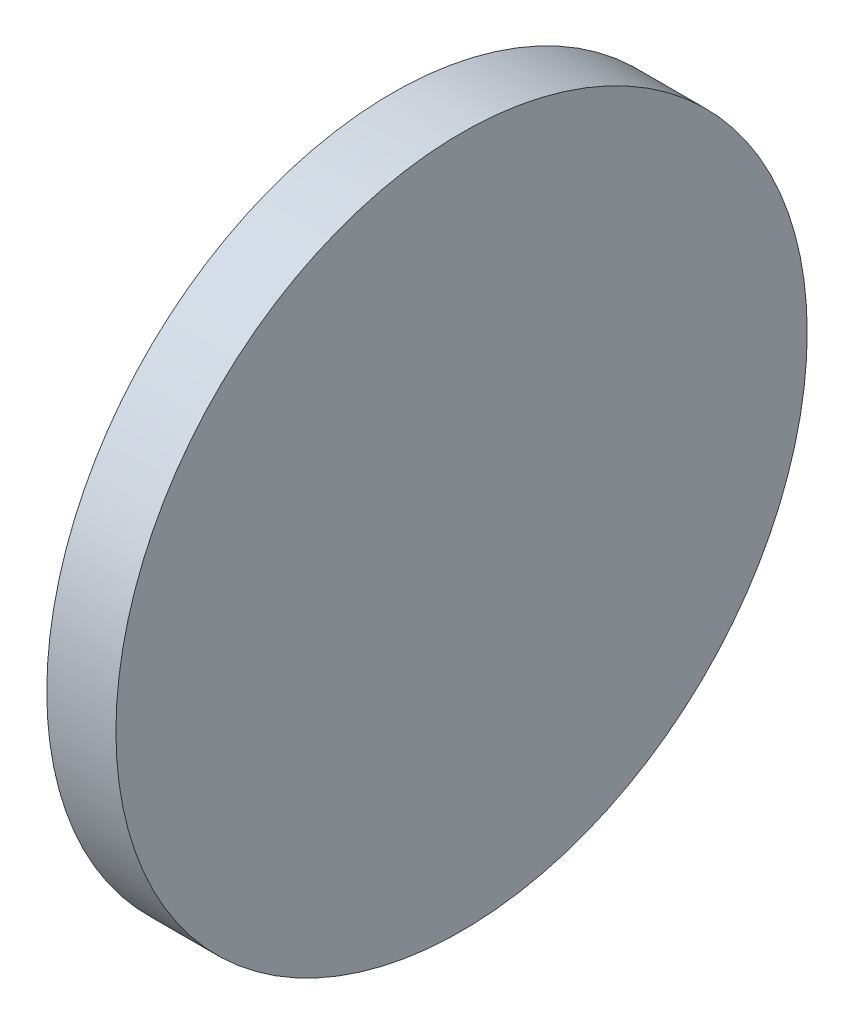
ISO-10303-21;
HEADER;
FILE_DESCRIPTION(('STEP AP214'),'2;1');
FILE_NAME('part.step','',(''),(''),'','','');
FILE_SCHEMA(('AUTOMOTIVE_DESIGN { 1 0 10303 214 1 1 1 1 }'));
ENDSEC;
DATA;
#1=APPLICATION_CONTEXT('core data for automotive mechanical design processes');
#2=APPLICATION_PROTOCOL_DEFINITION('international standard','automotive_design',2000,#1);
#3=PRODUCT_CONTEXT('',#1,'mechanical');
#4=PRODUCT('Part','Part','',(#3));
#5=PRODUCT_RELATED_PRODUCT_CATEGORY('part','',(#4));
#6=PRODUCT_DEFINITION_FORMATION('','',#4);
#7=PRODUCT_DEFINITION_CONTEXT('part definition',#1,'design');
#8=PRODUCT_DEFINITION('design','',#6,#7);
#9=PRODUCT_DEFINITION_SHAPE('','',#8);
#10=(LENGTH_UNIT() NAMED_UNIT(*) SI_UNIT(.MILLI.,.METRE.));
#11=(NAMED_UNIT(*) PLANE_ANGLE_UNIT() SI_UNIT($,.RADIAN.));
#12=(NAMED_UNIT(*) SI_UNIT($,.STERADIAN.) SOLID_ANGLE_UNIT());
#13=UNCERTAINTY_MEASURE_WITH_UNIT(LENGTH_MEASURE(1.E-05),#10,'distance_accuracy_value','');
#14=(GEOMETRIC_REPRESENTATION_CONTEXT(3) GLOBAL_UNCERTAINTY_ASSIGNED_CONTEXT((#13)) GLOBAL_UNIT_ASSIGNED_CONTEXT((#10,
#11,#12)) REPRESENTATION_CONTEXT('',''));
#15=CARTESIAN_POINT('',(0.,0.,0.));
#16=DIRECTION('',(0.,0.,1.));
#17=DIRECTION('',(1.,0.,0.));
#18=AXIS2_PLACEMENT_3D('',#15,#16,#17);
#19=CARTESIAN_POINT('',(0.,0.,0.));
#20=DIRECTION('',(1.,0.,0.));
#21=DIRECTION('',(0.,0.,-1.));
#22=AXIS2_PLACEMENT_3D('',#19,#20,#21);
#23=PLANE('',#22);
#24=CARTESIAN_POINT('',(0.,0.,-65.));
#25=DIRECTION('',(1.,0.,0.));
#26=DIRECTION('',(0.,0.,-1.));
#27=AXIS2_PLACEMENT_3D('',#24,#25,#26);
#28=CIRCLE('',#27,5.);
#29=CARTESIAN_POINT('',(0.,0.,-70.));
#30=VERTEX_POINT('',#29);
#31=EDGE_CURVE('E47',#30,#30,#28,.F.);
#32=ORIENTED_EDGE('',*,*,#31,.F.);
#33=EDGE_LOOP('',(#32));
#34=FACE_BOUND('',#33,.T.);
#35=CARTESIAN_POINT('',(0.,-65.,0.));
#36=DIRECTION('',(1.,0.,0.));
#37=DIRECTION('',(0.,0.,-1.));
#38=AXIS2_PLACEMENT_3D('',#35,#36,#37);
#39=CIRCLE('',#38,5.);
#40=CARTESIAN_POINT('',(0.,-65.,-5.));
#41=VERTEX_POINT('',#40);
#42=EDGE_CURVE('E57',#41,#41,#39,.F.);
#43=ORIENTED_EDGE('',*,*,#42,.F.);
#44=EDGE_LOOP('',(#43));
#45=FACE_BOUND('',#44,.T.);
#46=CARTESIAN_POINT('',(0.,0.,65.));
#47=DIRECTION('',(1.,0.,0.));
#48=DIRECTION('',(0.,0.,-1.));
#49=AXIS2_PLACEMENT_3D('',#46,#47,#48);
#50=CIRCLE('',#49,5.);
#51=CARTESIAN_POINT('',(0.,0.,60.));
#52=VERTEX_POINT('',#51);
#53=EDGE_CURVE('E67',#52,#52,#50,.F.);
#54=ORIENTED_EDGE('',*,*,#53,.F.);
#55=EDGE_LOOP('',(#54));
#56=FACE_BOUND('',#55,.T.);
#57=CARTESIAN_POINT('',(0.,65.,0.));
#58=DIRECTION('',(1.,0.,0.));
#59=DIRECTION('',(0.,0.,-1.));
#60=AXIS2_PLACEMENT_3D('',#57,#58,#59);
#61=CIRCLE('',#60,5.);
#62=CARTESIAN_POINT('',(0.,65.,-5.));
#63=VERTEX_POINT('',#62);
#64=EDGE_CURVE('E75',#63,#63,#61,.F.);
#65=ORIENTED_EDGE('',*,*,#64,.F.);
#66=EDGE_LOOP('',(#65));
#67=FACE_BOUND('',#66,.T.);
#68=CARTESIAN_POINT('',(0.,0.,0.));
#69=DIRECTION('',(1.,0.,0.));
#70=DIRECTION('',(0.,0.,-1.));
#71=AXIS2_PLACEMENT_3D('',#68,#69,#70);
#72=CIRCLE('',#71,100.);
#73=CARTESIAN_POINT('',(0.,0.,-100.));
#74=VERTEX_POINT('',#73);
#75=EDGE_CURVE('E80',#74,#74,#72,.T.);
#76=ORIENTED_EDGE('',*,*,#75,.F.);
#77=EDGE_LOOP('',(#76));
#78=FACE_BOUND('',#77,.T.);
#79=CARTESIAN_POINT('',(0.,45.9619407771253,45.9619407771258));
#80=DIRECTION('',(1.,0.,0.));
#81=DIRECTION('',(0.,0.,-1.));
#82=AXIS2_PLACEMENT_3D('',#79,#80,#81);
#83=CIRCLE('',#82,5.);
#84=CARTESIAN_POINT('',(0.,45.9619407771253,40.9619407771258));
#85=VERTEX_POINT('',#84);
#86=EDGE_CURVE('E71',#85,#85,#83,.F.);
#87=ORIENTED_EDGE('',*,*,#86,.F.);
#88=EDGE_LOOP('',(#87));
#89=FACE_BOUND('',#88,.T.);
#90=CARTESIAN_POINT('',(0.,-45.9619407771258,45.9619407771254));
#91=DIRECTION('',(1.,0.,0.));
#92=DIRECTION('',(0.,0.,-1.));
#93=AXIS2_PLACEMENT_3D('',#90,#91,#92);
#94=CIRCLE('',#93,5.);
#95=CARTESIAN_POINT('',(0.,-45.9619407771258,40.9619407771254));
#96=VERTEX_POINT('',#95);
#97=EDGE_CURVE('E63',#96,#96,#94,.F.);
#98=ORIENTED_EDGE('',*,*,#97,.F.);
#99=EDGE_LOOP('',(#98));
#100=FACE_BOUND('',#99,.T.);
#101=CARTESIAN_POINT('',(0.,-45.9619407771253,-45.9619407771258));
#102=DIRECTION('',(1.,0.,0.));
#103=DIRECTION('',(0.,0.,-1.));
#104=AXIS2_PLACEMENT_3D('',#101,#102,#103);
#105=CIRCLE('',#104,5.);
#106=CARTESIAN_POINT('',(0.,-45.9619407771253,-50.9619407771258));
#107=VERTEX_POINT('',#106);
#108=EDGE_CURVE('E52',#107,#107,#105,.F.);
#109=ORIENTED_EDGE('',*,*,#108,.F.);
#110=EDGE_LOOP('',(#109));
#111=FACE_BOUND('',#110,.T.);
#112=CARTESIAN_POINT('',(0.,45.9619407771258,-45.9619407771254));
#113=DIRECTION('',(1.,0.,0.));
#114=DIRECTION('',(0.,0.,-1.));
#115=AXIS2_PLACEMENT_3D('',#112,#113,#114);
#116=CIRCLE('',#115,5.);
#117=CARTESIAN_POINT('',(0.,45.9619407771258,-50.9619407771254));
#118=VERTEX_POINT('',#117);
#119=EDGE_CURVE('E11',#118,#118,#116,.F.);
#120=ORIENTED_EDGE('',*,*,#119,.F.);
#121=EDGE_LOOP('',(#120));
#122=FACE_BOUND('',#121,.T.);
#123=ADVANCED_FACE('F39',(#34,#45,#56,#67,#78,#89,#100,#111,#122),#23,.F.);
#124=CARTESIAN_POINT('',(20.,0.,0.));
#125=DIRECTION('',(-1.,0.,0.));
#126=DIRECTION('',(0.,0.,1.));
#127=AXIS2_PLACEMENT_3D('',#124,#125,#126);
#128=CYLINDRICAL_SURFACE('',#127,100.);
#129=CARTESIAN_POINT('',(20.,0.,0.));
#130=DIRECTION('',(1.,0.,0.));
#131=DIRECTION('',(0.,0.,-1.));
#132=AXIS2_PLACEMENT_3D('',#129,#130,#131);
#133=CIRCLE('',#132,100.);
#134=CARTESIAN_POINT('',(20.,0.,-100.));
#135=VERTEX_POINT('',#134);
#136=EDGE_CURVE('E79',#135,#135,#133,.T.);
#137=ORIENTED_EDGE('',*,*,#136,.F.);
#138=EDGE_LOOP('',(#137));
#139=FACE_BOUND('',#138,.T.);
#140=ORIENTED_EDGE('',*,*,#75,.T.);
#141=EDGE_LOOP('',(#140));
#142=FACE_BOUND('',#141,.T.);
#143=ADVANCED_FACE('F41',(#139,#142),#128,.T.);
#144=CARTESIAN_POINT('',(20.,0.,0.));
#145=DIRECTION('',(1.,0.,0.));
#146=DIRECTION('',(0.,0.,-1.));
#147=AXIS2_PLACEMENT_3D('',#144,#145,#146);
#148=PLANE('',#147);
#149=ORIENTED_EDGE('',*,*,#136,.T.);
#150=EDGE_LOOP('',(#149));
#151=FACE_BOUND('',#150,.T.);
#152=ADVANCED_FACE('F207',(#151),#148,.T.);
#153=CARTESIAN_POINT('',(-10.,65.,0.));
#154=DIRECTION('',(-1.,0.,0.));
#155=DIRECTION('',(0.,0.,1.));
#156=AXIS2_PLACEMENT_3D('',#153,#154,#155);
#157=PLANE('',#156);
#158=CARTESIAN_POINT('',(-10.,65.,0.));
#159=DIRECTION('',(-1.,0.,0.));
#160=DIRECTION('',(0.,0.,1.));
#161=AXIS2_PLACEMENT_3D('',#158,#159,#160);
#162=CIRCLE('',#161,5.);
#163=CARTESIAN_POINT('',(-10.,65.,5.));
#164=VERTEX_POINT('',#163);
#165=EDGE_CURVE('E93',#164,#164,#162,.T.);
#166=ORIENTED_EDGE('',*,*,#165,.T.);
#167=EDGE_LOOP('',(#166));
#168=FACE_BOUND('',#167,.T.);
#169=CARTESIAN_POINT('',(-10.,65.,0.));
#170=DIRECTION('',(-1.,0.,0.));
#171=DIRECTION('',(0.,0.,1.));
#172=AXIS2_PLACEMENT_3D('',#169,#170,#171);
#173=CIRCLE('',#172,1.3);
#174=CARTESIAN_POINT('',(-10.,65.,1.3));
#175=VERTEX_POINT('',#174);
#176=EDGE_CURVE('E123',#175,#175,#173,.T.);
#177=ORIENTED_EDGE('',*,*,#176,.F.);
#178=EDGE_LOOP('',(#177));
#179=FACE_BOUND('',#178,.T.);
#180=ADVANCED_FACE('F213',(#168,#179),#157,.T.);
#181=CARTESIAN_POINT('',(-10.,65.,0.));
#182=DIRECTION('',(1.,0.,0.));
#183=DIRECTION('',(0.,0.,-1.));
#184=AXIS2_PLACEMENT_3D('',#181,#182,#183);
#185=CYLINDRICAL_SURFACE('',#184,5.);
#186=ORIENTED_EDGE('',*,*,#165,.F.);
#187=EDGE_LOOP('',(#186));
#188=FACE_BOUND('',#187,.T.);
#189=ORIENTED_EDGE('',*,*,#64,.T.);
#190=EDGE_LOOP('',(#189));
#191=FACE_BOUND('',#190,.T.);
#192=ADVANCED_FACE('F279',(#188,#191),#185,.T.);
#193=CARTESIAN_POINT('',(18.,0.,0.));
#194=DIRECTION('',(1.,0.,0.));
#195=DIRECTION('',(0.,0.,-1.));
#196=AXIS2_PLACEMENT_3D('',#193,#194,#195);
#197=PLANE('',#196);
#198=CARTESIAN_POINT('',(18.,65.,0.));
#199=DIRECTION('',(1.,0.,0.));
#200=DIRECTION('',(0.,0.,-1.));
#201=AXIS2_PLACEMENT_3D('',#198,#199,#200);
#202=CIRCLE('',#201,1.3);
#203=CARTESIAN_POINT('',(18.,65.,-1.3));
#204=VERTEX_POINT('',#203);
#205=EDGE_CURVE('E84',#204,#204,#202,.F.);
#206=ORIENTED_EDGE('',*,*,#205,.T.);
#207=EDGE_LOOP('',(#206));
#208=FACE_BOUND('',#207,.T.);
#209=ADVANCED_FACE('F275',(#208),#197,.F.);
#210=CARTESIAN_POINT('',(23.6769552621701,65.,0.));
#211=DIRECTION('',(-1.,0.,0.));
#212=DIRECTION('',(0.,0.,1.));
#213=AXIS2_PLACEMENT_3D('',#210,#211,#212);
#214=CYLINDRICAL_SURFACE('',#213,1.3);
#215=ORIENTED_EDGE('',*,*,#205,.F.);
#216=EDGE_LOOP('',(#215));
#217=FACE_BOUND('',#216,.T.);
#218=ORIENTED_EDGE('',*,*,#176,.T.);
#219=EDGE_LOOP('',(#218));
#220=FACE_BOUND('',#219,.T.);
#221=ADVANCED_FACE('F278',(#217,#220),#214,.F.);
#222=CARTESIAN_POINT('',(-10.,45.9619407771253,45.9619407771258));
#223=DIRECTION('',(-1.,0.,0.));
#224=DIRECTION('',(0.,0.,1.));
#225=AXIS2_PLACEMENT_3D('',#222,#223,#224);
#226=PLANE('',#225);
#227=CARTESIAN_POINT('',(-10.,45.9619407771253,45.9619407771258));
#228=DIRECTION('',(-1.,0.,0.));
#229=DIRECTION('',(0.,0.,1.));
#230=AXIS2_PLACEMENT_3D('',#227,#228,#229);
#231=CIRCLE('',#230,5.);
#232=CARTESIAN_POINT('',(-10.,45.9619407771253,50.9619407771258));
#233=VERTEX_POINT('',#232);
#234=EDGE_CURVE('E127',#233,#233,#231,.T.);
#235=ORIENTED_EDGE('',*,*,#234,.T.);
#236=EDGE_LOOP('',(#235));
#237=FACE_BOUND('',#236,.T.);
#238=CARTESIAN_POINT('',(-10.,45.9619407771253,45.9619407771258));
#239=DIRECTION('',(-1.,0.,0.));
#240=DIRECTION('',(0.,0.,1.));
#241=AXIS2_PLACEMENT_3D('',#238,#239,#240);
#242=CIRCLE('',#241,1.30000000000001);
#243=CARTESIAN_POINT('',(-10.,45.9619407771253,47.2619407771258));
#244=VERTEX_POINT('',#243);
#245=EDGE_CURVE('E131',#244,#244,#242,.T.);
#246=ORIENTED_EDGE('',*,*,#245,.F.);
#247=EDGE_LOOP('',(#246));
#248=FACE_BOUND('',#247,.T.);
#249=ADVANCED_FACE('F283',(#237,#248),#226,.T.);
#250=CARTESIAN_POINT('',(-10.,45.9619407771253,45.9619407771258));
#251=DIRECTION('',(1.,0.,0.));
#252=DIRECTION('',(0.,0.,-1.));
#253=AXIS2_PLACEMENT_3D('',#250,#251,#252);
#254=CYLINDRICAL_SURFACE('',#253,5.);
#255=ORIENTED_EDGE('',*,*,#234,.F.);
#256=EDGE_LOOP('',(#255));
#257=FACE_BOUND('',#256,.T.);
#258=ORIENTED_EDGE('',*,*,#86,.T.);
#259=EDGE_LOOP('',(#258));
#260=FACE_BOUND('',#259,.T.);
#261=ADVANCED_FACE('F273',(#257,#260),#254,.T.);
#262=CARTESIAN_POINT('',(18.,0.,0.));
#263=DIRECTION('',(1.,0.,0.));
#264=DIRECTION('',(0.,0.,-1.));
#265=AXIS2_PLACEMENT_3D('',#262,#263,#264);
#266=PLANE('',#265);
#267=CARTESIAN_POINT('',(18.,45.9619407771253,45.9619407771258));
#268=DIRECTION('',(1.,0.,0.));
#269=DIRECTION('',(0.,0.,-1.));
#270=AXIS2_PLACEMENT_3D('',#267,#268,#269);
#271=CIRCLE('',#270,1.30000000000001);
#272=CARTESIAN_POINT('',(18.,45.9619407771253,44.6619407771258));
#273=VERTEX_POINT('',#272);
#274=EDGE_CURVE('E113',#273,#273,#271,.F.);
#275=ORIENTED_EDGE('',*,*,#274,.T.);
#276=EDGE_LOOP('',(#275));
#277=FACE_BOUND('',#276,.T.);
#278=ADVANCED_FACE('F269',(#277),#266,.F.);
#279=CARTESIAN_POINT('',(23.6769552621701,45.9619407771253,45.9619407771258));
#280=DIRECTION('',(-1.,0.,0.));
#281=DIRECTION('',(0.,0.,1.));
#282=AXIS2_PLACEMENT_3D('',#279,#280,#281);
#283=CYLINDRICAL_SURFACE('',#282,1.30000000000001);
#284=ORIENTED_EDGE('',*,*,#274,.F.);
#285=EDGE_LOOP('',(#284));
#286=FACE_BOUND('',#285,.T.);
#287=ORIENTED_EDGE('',*,*,#245,.T.);
#288=EDGE_LOOP('',(#287));
#289=FACE_BOUND('',#288,.T.);
#290=ADVANCED_FACE('F265',(#286,#289),#283,.F.);
#291=CARTESIAN_POINT('',(-10.,0.,65.));
#292=DIRECTION('',(-1.,0.,0.));
#293=DIRECTION('',(0.,0.,1.));
#294=AXIS2_PLACEMENT_3D('',#291,#292,#293);
#295=PLANE('',#294);
#296=CARTESIAN_POINT('',(-10.,0.,65.));
#297=DIRECTION('',(-1.,0.,0.));
#298=DIRECTION('',(0.,0.,1.));
#299=AXIS2_PLACEMENT_3D('',#296,#297,#298);
#300=CIRCLE('',#299,5.);
#301=CARTESIAN_POINT('',(-10.,0.,70.));
#302=VERTEX_POINT('',#301);
#303=EDGE_CURVE('E135',#302,#302,#300,.T.);
#304=ORIENTED_EDGE('',*,*,#303,.T.);
#305=EDGE_LOOP('',(#304));
#306=FACE_BOUND('',#305,.T.);
#307=CARTESIAN_POINT('',(-10.,0.,65.));
#308=DIRECTION('',(-1.,0.,0.));
#309=DIRECTION('',(0.,0.,1.));
#310=AXIS2_PLACEMENT_3D('',#307,#308,#309);
#311=CIRCLE('',#310,1.29999999999999);
#312=CARTESIAN_POINT('',(-10.,0.,66.3));
#313=VERTEX_POINT('',#312);
#314=EDGE_CURVE('E139',#313,#313,#311,.T.);
#315=ORIENTED_EDGE('',*,*,#314,.F.);
#316=EDGE_LOOP('',(#315));
#317=FACE_BOUND('',#316,.T.);
#318=ADVANCED_FACE('F268',(#306,#317),#295,.T.);
#319=CARTESIAN_POINT('',(-10.,0.,65.));
#320=DIRECTION('',(1.,0.,0.));
#321=DIRECTION('',(0.,0.,-1.));
#322=AXIS2_PLACEMENT_3D('',#319,#320,#321);
#323=CYLINDRICAL_SURFACE('',#322,5.);
#324=ORIENTED_EDGE('',*,*,#303,.F.);
#325=EDGE_LOOP('',(#324));
#326=FACE_BOUND('',#325,.T.);
#327=ORIENTED_EDGE('',*,*,#53,.T.);
#328=EDGE_LOOP('',(#327));
#329=FACE_BOUND('',#328,.T.);
#330=ADVANCED_FACE('F263',(#326,#329),#323,.T.);
#331=CARTESIAN_POINT('',(18.,0.,0.));
#332=DIRECTION('',(1.,0.,0.));
#333=DIRECTION('',(0.,0.,-1.));
#334=AXIS2_PLACEMENT_3D('',#331,#332,#333);
#335=PLANE('',#334);
#336=CARTESIAN_POINT('',(18.,0.,65.));
#337=DIRECTION('',(1.,0.,0.));
#338=DIRECTION('',(0.,0.,-1.));
#339=AXIS2_PLACEMENT_3D('',#336,#337,#338);
#340=CIRCLE('',#339,1.29999999999999);
#341=CARTESIAN_POINT('',(18.,0.,63.7));
#342=VERTEX_POINT('',#341);
#343=EDGE_CURVE('E109',#342,#342,#340,.F.);
#344=ORIENTED_EDGE('',*,*,#343,.T.);
#345=EDGE_LOOP('',(#344));
#346=FACE_BOUND('',#345,.T.);
#347=ADVANCED_FACE('F259',(#346),#335,.F.);
#348=CARTESIAN_POINT('',(23.6769552621701,0.,65.));
#349=DIRECTION('',(-1.,0.,0.));
#350=DIRECTION('',(0.,0.,1.));
#351=AXIS2_PLACEMENT_3D('',#348,#349,#350);
#352=CYLINDRICAL_SURFACE('',#351,1.29999999999999);
#353=ORIENTED_EDGE('',*,*,#343,.F.);
#354=EDGE_LOOP('',(#353));
#355=FACE_BOUND('',#354,.T.);
#356=ORIENTED_EDGE('',*,*,#314,.T.);
#357=EDGE_LOOP('',(#356));
#358=FACE_BOUND('',#357,.T.);
#359=ADVANCED_FACE('F255',(#355,#358),#352,.F.);
#360=CARTESIAN_POINT('',(-10.,-45.9619407771258,45.9619407771254));
#361=DIRECTION('',(-1.,0.,0.));
#362=DIRECTION('',(0.,0.,1.));
#363=AXIS2_PLACEMENT_3D('',#360,#361,#362);
#364=PLANE('',#363);
#365=CARTESIAN_POINT('',(-10.,-45.9619407771258,45.9619407771254));
#366=DIRECTION('',(-1.,0.,0.));
#367=DIRECTION('',(0.,0.,1.));
#368=AXIS2_PLACEMENT_3D('',#365,#366,#367);
#369=CIRCLE('',#368,5.);
#370=CARTESIAN_POINT('',(-10.,-45.9619407771258,50.9619407771254));
#371=VERTEX_POINT('',#370);
#372=EDGE_CURVE('E143',#371,#371,#369,.T.);
#373=ORIENTED_EDGE('',*,*,#372,.T.);
#374=EDGE_LOOP('',(#373));
#375=FACE_BOUND('',#374,.T.);
#376=CARTESIAN_POINT('',(-10.,-45.9619407771258,45.9619407771254));
#377=DIRECTION('',(-1.,0.,0.));
#378=DIRECTION('',(0.,0.,1.));
#379=AXIS2_PLACEMENT_3D('',#376,#377,#378);
#380=CIRCLE('',#379,1.3);
#381=CARTESIAN_POINT('',(-10.,-45.9619407771258,47.2619407771254));
#382=VERTEX_POINT('',#381);
#383=EDGE_CURVE('E147',#382,#382,#380,.T.);
#384=ORIENTED_EDGE('',*,*,#383,.F.);
#385=EDGE_LOOP('',(#384));
#386=FACE_BOUND('',#385,.T.);
#387=ADVANCED_FACE('F258',(#375,#386),#364,.T.);
#388=CARTESIAN_POINT('',(-10.,-45.9619407771258,45.9619407771254));
#389=DIRECTION('',(1.,0.,0.));
#390=DIRECTION('',(0.,0.,-1.));
#391=AXIS2_PLACEMENT_3D('',#388,#389,#390);
#392=CYLINDRICAL_SURFACE('',#391,5.);
#393=ORIENTED_EDGE('',*,*,#372,.F.);
#394=EDGE_LOOP('',(#393));
#395=FACE_BOUND('',#394,.T.);
#396=ORIENTED_EDGE('',*,*,#97,.T.);
#397=EDGE_LOOP('',(#396));
#398=FACE_BOUND('',#397,.T.);
#399=ADVANCED_FACE('F253',(#395,#398),#392,.T.);
#400=CARTESIAN_POINT('',(18.,0.,0.));
#401=DIRECTION('',(1.,0.,0.));
#402=DIRECTION('',(0.,0.,-1.));
#403=AXIS2_PLACEMENT_3D('',#400,#401,#402);
#404=PLANE('',#403);
#405=CARTESIAN_POINT('',(18.,-45.9619407771258,45.9619407771254));
#406=DIRECTION('',(1.,0.,0.));
#407=DIRECTION('',(0.,0.,-1.));
#408=AXIS2_PLACEMENT_3D('',#405,#406,#407);
#409=CIRCLE('',#408,1.3);
#410=CARTESIAN_POINT('',(18.,-45.9619407771258,44.6619407771254));
#411=VERTEX_POINT('',#410);
#412=EDGE_CURVE('E105',#411,#411,#409,.F.);
#413=ORIENTED_EDGE('',*,*,#412,.T.);
#414=EDGE_LOOP('',(#413));
#415=FACE_BOUND('',#414,.T.);
#416=ADVANCED_FACE('F249',(#415),#404,.F.);
#417=CARTESIAN_POINT('',(23.6769552621701,-45.9619407771258,45.9619407771254));
#418=DIRECTION('',(-1.,0.,0.));
#419=DIRECTION('',(0.,0.,1.));
#420=AXIS2_PLACEMENT_3D('',#417,#418,#419);
#421=CYLINDRICAL_SURFACE('',#420,1.3);
#422=ORIENTED_EDGE('',*,*,#412,.F.);
#423=EDGE_LOOP('',(#422));
#424=FACE_BOUND('',#423,.T.);
#425=ORIENTED_EDGE('',*,*,#383,.T.);
#426=EDGE_LOOP('',(#425));
#427=FACE_BOUND('',#426,.T.);
#428=ADVANCED_FACE('F245',(#424,#427),#421,.F.);
#429=CARTESIAN_POINT('',(-10.,-65.,0.));
#430=DIRECTION('',(-1.,0.,0.));
#431=DIRECTION('',(0.,0.,1.));
#432=AXIS2_PLACEMENT_3D('',#429,#430,#431);
#433=PLANE('',#432);
#434=CARTESIAN_POINT('',(-10.,-65.,0.));
#435=DIRECTION('',(-1.,0.,0.));
#436=DIRECTION('',(0.,0.,1.));
#437=AXIS2_PLACEMENT_3D('',#434,#435,#436);
#438=CIRCLE('',#437,5.);
#439=CARTESIAN_POINT('',(-10.,-65.,5.));
#440=VERTEX_POINT('',#439);
#441=EDGE_CURVE('E151',#440,#440,#438,.T.);
#442=ORIENTED_EDGE('',*,*,#441,.T.);
#443=EDGE_LOOP('',(#442));
#444=FACE_BOUND('',#443,.T.);
#445=CARTESIAN_POINT('',(-10.,-65.,0.));
#446=DIRECTION('',(-1.,0.,0.));
#447=DIRECTION('',(0.,0.,1.));
#448=AXIS2_PLACEMENT_3D('',#445,#446,#447);
#449=CIRCLE('',#448,1.3);
#450=CARTESIAN_POINT('',(-10.,-65.,1.3));
#451=VERTEX_POINT('',#450);
#452=EDGE_CURVE('E155',#451,#451,#449,.T.);
#453=ORIENTED_EDGE('',*,*,#452,.F.);
#454=EDGE_LOOP('',(#453));
#455=FACE_BOUND('',#454,.T.);
#456=ADVANCED_FACE('F248',(#444,#455),#433,.T.);
#457=CARTESIAN_POINT('',(-10.,-65.,0.));
#458=DIRECTION('',(1.,0.,0.));
#459=DIRECTION('',(0.,0.,-1.));
#460=AXIS2_PLACEMENT_3D('',#457,#458,#459);
#461=CYLINDRICAL_SURFACE('',#460,5.);
#462=ORIENTED_EDGE('',*,*,#441,.F.);
#463=EDGE_LOOP('',(#462));
#464=FACE_BOUND('',#463,.T.);
#465=ORIENTED_EDGE('',*,*,#42,.T.);
#466=EDGE_LOOP('',(#465));
#467=FACE_BOUND('',#466,.T.);
#468=ADVANCED_FACE('F243',(#464,#467),#461,.T.);
#469=CARTESIAN_POINT('',(18.,0.,0.));
#470=DIRECTION('',(1.,0.,0.));
#471=DIRECTION('',(0.,0.,-1.));
#472=AXIS2_PLACEMENT_3D('',#469,#470,#471);
#473=PLANE('',#472);
#474=CARTESIAN_POINT('',(18.,-65.,0.));
#475=DIRECTION('',(1.,0.,0.));
#476=DIRECTION('',(0.,0.,-1.));
#477=AXIS2_PLACEMENT_3D('',#474,#475,#476);
#478=CIRCLE('',#477,1.3);
#479=CARTESIAN_POINT('',(18.,-65.,-1.3));
#480=VERTEX_POINT('',#479);
#481=EDGE_CURVE('E101',#480,#480,#478,.F.);
#482=ORIENTED_EDGE('',*,*,#481,.T.);
#483=EDGE_LOOP('',(#482));
#484=FACE_BOUND('',#483,.T.);
#485=ADVANCED_FACE('F239',(#484),#473,.F.);
#486=CARTESIAN_POINT('',(23.6769552621701,-65.,0.));
#487=DIRECTION('',(-1.,0.,0.));
#488=DIRECTION('',(0.,0.,1.));
#489=AXIS2_PLACEMENT_3D('',#486,#487,#488);
#490=CYLINDRICAL_SURFACE('',#489,1.3);
#491=ORIENTED_EDGE('',*,*,#481,.F.);
#492=EDGE_LOOP('',(#491));
#493=FACE_BOUND('',#492,.T.);
#494=ORIENTED_EDGE('',*,*,#452,.T.);
#495=EDGE_LOOP('',(#494));
#496=FACE_BOUND('',#495,.T.);
#497=ADVANCED_FACE('F235',(#493,#496),#490,.F.);
#498=CARTESIAN_POINT('',(-10.,-45.9619407771253,-45.9619407771258));
#499=DIRECTION('',(-1.,0.,0.));
#500=DIRECTION('',(0.,0.,1.));
#501=AXIS2_PLACEMENT_3D('',#498,#499,#500);
#502=PLANE('',#501);
#503=CARTESIAN_POINT('',(-10.,-45.9619407771253,-45.9619407771258));
#504=DIRECTION('',(-1.,0.,0.));
#505=DIRECTION('',(0.,0.,1.));
#506=AXIS2_PLACEMENT_3D('',#503,#504,#505);
#507=CIRCLE('',#506,5.);
#508=CARTESIAN_POINT('',(-10.,-45.9619407771253,-40.9619407771258));
#509=VERTEX_POINT('',#508);
#510=EDGE_CURVE('E159',#509,#509,#507,.T.);
#511=ORIENTED_EDGE('',*,*,#510,.T.);
#512=EDGE_LOOP('',(#511));
#513=FACE_BOUND('',#512,.T.);
#514=CARTESIAN_POINT('',(-10.,-45.9619407771253,-45.9619407771258));
#515=DIRECTION('',(-1.,0.,0.));
#516=DIRECTION('',(0.,0.,1.));
#517=AXIS2_PLACEMENT_3D('',#514,#515,#516);
#518=CIRCLE('',#517,1.3);
#519=CARTESIAN_POINT('',(-10.,-45.9619407771253,-44.6619407771258));
#520=VERTEX_POINT('',#519);
#521=EDGE_CURVE('E163',#520,#520,#518,.T.);
#522=ORIENTED_EDGE('',*,*,#521,.F.);
#523=EDGE_LOOP('',(#522));
#524=FACE_BOUND('',#523,.T.);
#525=ADVANCED_FACE('F238',(#513,#524),#502,.T.);
#526=CARTESIAN_POINT('',(-10.,-45.9619407771253,-45.9619407771258));
#527=DIRECTION('',(1.,0.,0.));
#528=DIRECTION('',(0.,0.,-1.));
#529=AXIS2_PLACEMENT_3D('',#526,#527,#528);
#530=CYLINDRICAL_SURFACE('',#529,5.);
#531=ORIENTED_EDGE('',*,*,#510,.F.);
#532=EDGE_LOOP('',(#531));
#533=FACE_BOUND('',#532,.T.);
#534=ORIENTED_EDGE('',*,*,#108,.T.);
#535=EDGE_LOOP('',(#534));
#536=FACE_BOUND('',#535,.T.);
#537=ADVANCED_FACE('F233',(#533,#536),#530,.T.);
#538=CARTESIAN_POINT('',(18.,0.,0.));
#539=DIRECTION('',(1.,0.,0.));
#540=DIRECTION('',(0.,0.,-1.));
#541=AXIS2_PLACEMENT_3D('',#538,#539,#540);
#542=PLANE('',#541);
#543=CARTESIAN_POINT('',(18.,-45.9619407771253,-45.9619407771258));
#544=DIRECTION('',(1.,0.,0.));
#545=DIRECTION('',(0.,0.,-1.));
#546=AXIS2_PLACEMENT_3D('',#543,#544,#545);
#547=CIRCLE('',#546,1.3);
#548=CARTESIAN_POINT('',(18.,-45.9619407771253,-47.2619407771258));
#549=VERTEX_POINT('',#548);
#550=EDGE_CURVE('E97',#549,#549,#547,.F.);
#551=ORIENTED_EDGE('',*,*,#550,.T.);
#552=EDGE_LOOP('',(#551));
#553=FACE_BOUND('',#552,.T.);
#554=ADVANCED_FACE('F229',(#553),#542,.F.);
#555=CARTESIAN_POINT('',(23.6769552621701,-45.9619407771253,-45.9619407771258));
#556=DIRECTION('',(-1.,0.,0.));
#557=DIRECTION('',(0.,0.,1.));
#558=AXIS2_PLACEMENT_3D('',#555,#556,#557);
#559=CYLINDRICAL_SURFACE('',#558,1.3);
#560=ORIENTED_EDGE('',*,*,#550,.F.);
#561=EDGE_LOOP('',(#560));
#562=FACE_BOUND('',#561,.T.);
#563=ORIENTED_EDGE('',*,*,#521,.T.);
#564=EDGE_LOOP('',(#563));
#565=FACE_BOUND('',#564,.T.);
#566=ADVANCED_FACE('F225',(#562,#565),#559,.F.);
#567=CARTESIAN_POINT('',(-10.,0.,-65.));
#568=DIRECTION('',(-1.,0.,0.));
#569=DIRECTION('',(0.,0.,1.));
#570=AXIS2_PLACEMENT_3D('',#567,#568,#569);
#571=PLANE('',#570);
#572=CARTESIAN_POINT('',(-10.,0.,-65.));
#573=DIRECTION('',(-1.,0.,0.));
#574=DIRECTION('',(0.,0.,1.));
#575=AXIS2_PLACEMENT_3D('',#572,#573,#574);
#576=CIRCLE('',#575,5.);
#577=CARTESIAN_POINT('',(-10.,0.,-60.));
#578=VERTEX_POINT('',#577);
#579=EDGE_CURVE('E167',#578,#578,#576,.T.);
#580=ORIENTED_EDGE('',*,*,#579,.T.);
#581=EDGE_LOOP('',(#580));
#582=FACE_BOUND('',#581,.T.);
#583=CARTESIAN_POINT('',(-10.,0.,-65.));
#584=DIRECTION('',(-1.,0.,0.));
#585=DIRECTION('',(0.,0.,1.));
#586=AXIS2_PLACEMENT_3D('',#583,#584,#585);
#587=CIRCLE('',#586,1.29999999999999);
#588=CARTESIAN_POINT('',(-10.,0.,-63.7));
#589=VERTEX_POINT('',#588);
#590=EDGE_CURVE('E171',#589,#589,#587,.T.);
#591=ORIENTED_EDGE('',*,*,#590,.F.);
#592=EDGE_LOOP('',(#591));
#593=FACE_BOUND('',#592,.T.);
#594=ADVANCED_FACE('F228',(#582,#593),#571,.T.);
#595=CARTESIAN_POINT('',(-10.,0.,-65.));
#596=DIRECTION('',(1.,0.,0.));
#597=DIRECTION('',(0.,0.,-1.));
#598=AXIS2_PLACEMENT_3D('',#595,#596,#597);
#599=CYLINDRICAL_SURFACE('',#598,5.);
#600=ORIENTED_EDGE('',*,*,#579,.F.);
#601=EDGE_LOOP('',(#600));
#602=FACE_BOUND('',#601,.T.);
#603=ORIENTED_EDGE('',*,*,#31,.T.);
#604=EDGE_LOOP('',(#603));
#605=FACE_BOUND('',#604,.T.);
#606=ADVANCED_FACE('F223',(#602,#605),#599,.T.);
#607=CARTESIAN_POINT('',(18.,0.,0.));
#608=DIRECTION('',(1.,0.,0.));
#609=DIRECTION('',(0.,0.,-1.));
#610=AXIS2_PLACEMENT_3D('',#607,#608,#609);
#611=PLANE('',#610);
#612=CARTESIAN_POINT('',(18.,0.,-65.));
#613=DIRECTION('',(1.,0.,0.));
#614=DIRECTION('',(0.,0.,-1.));
#615=AXIS2_PLACEMENT_3D('',#612,#613,#614);
#616=CIRCLE('',#615,1.29999999999999);
#617=CARTESIAN_POINT('',(18.,0.,-66.3));
#618=VERTEX_POINT('',#617);
#619=EDGE_CURVE('E92',#618,#618,#616,.F.);
#620=ORIENTED_EDGE('',*,*,#619,.T.);
#621=EDGE_LOOP('',(#620));
#622=FACE_BOUND('',#621,.T.);
#623=ADVANCED_FACE('F199',(#622),#611,.F.);
#624=CARTESIAN_POINT('',(23.6769552621701,0.,-65.));
#625=DIRECTION('',(-1.,0.,0.));
#626=DIRECTION('',(0.,0.,1.));
#627=AXIS2_PLACEMENT_3D('',#624,#625,#626);
#628=CYLINDRICAL_SURFACE('',#627,1.29999999999999);
#629=ORIENTED_EDGE('',*,*,#619,.F.);
#630=EDGE_LOOP('',(#629));
#631=FACE_BOUND('',#630,.T.);
#632=ORIENTED_EDGE('',*,*,#590,.T.);
#633=EDGE_LOOP('',(#632));
#634=FACE_BOUND('',#633,.T.);
#635=ADVANCED_FACE('F189',(#631,#634),#628,.F.);
#636=CARTESIAN_POINT('',(-10.,45.9619407771258,-45.9619407771254));
#637=DIRECTION('',(-1.,0.,0.));
#638=DIRECTION('',(0.,0.,1.));
#639=AXIS2_PLACEMENT_3D('',#636,#637,#638);
#640=PLANE('',#639);
#641=CARTESIAN_POINT('',(-10.,45.9619407771258,-45.9619407771254));
#642=DIRECTION('',(-1.,0.,0.));
#643=DIRECTION('',(0.,0.,1.));
#644=AXIS2_PLACEMENT_3D('',#641,#642,#643);
#645=CIRCLE('',#644,5.);
#646=CARTESIAN_POINT('',(-10.,45.9619407771258,-40.9619407771254));
#647=VERTEX_POINT('',#646);
#648=EDGE_CURVE('E175',#647,#647,#645,.T.);
#649=ORIENTED_EDGE('',*,*,#648,.T.);
#650=EDGE_LOOP('',(#649));
#651=FACE_BOUND('',#650,.T.);
#652=CARTESIAN_POINT('',(-10.,45.9619407771258,-45.9619407771254));
#653=DIRECTION('',(-1.,0.,0.));
#654=DIRECTION('',(0.,0.,1.));
#655=AXIS2_PLACEMENT_3D('',#652,#653,#654);
#656=CIRCLE('',#655,1.30000000000003);
#657=CARTESIAN_POINT('',(-10.,45.9619407771258,-44.6619407771253));
#658=VERTEX_POINT('',#657);
#659=EDGE_CURVE('E179',#658,#658,#656,.T.);
#660=ORIENTED_EDGE('',*,*,#659,.F.);
#661=EDGE_LOOP('',(#660));
#662=FACE_BOUND('',#661,.T.);
#663=ADVANCED_FACE('F186',(#651,#662),#640,.T.);
#664=CARTESIAN_POINT('',(-10.,45.9619407771258,-45.9619407771254));
#665=DIRECTION('',(1.,0.,0.));
#666=DIRECTION('',(0.,0.,-1.));
#667=AXIS2_PLACEMENT_3D('',#664,#665,#666);
#668=CYLINDRICAL_SURFACE('',#667,5.);
#669=ORIENTED_EDGE('',*,*,#648,.F.);
#670=EDGE_LOOP('',(#669));
#671=FACE_BOUND('',#670,.T.);
#672=ORIENTED_EDGE('',*,*,#119,.T.);
#673=EDGE_LOOP('',(#672));
#674=FACE_BOUND('',#673,.T.);
#675=ADVANCED_FACE('F188',(#671,#674),#668,.T.);
#676=CARTESIAN_POINT('',(18.,0.,0.));
#677=DIRECTION('',(1.,0.,0.));
#678=DIRECTION('',(0.,0.,-1.));
#679=AXIS2_PLACEMENT_3D('',#676,#677,#678);
#680=PLANE('',#679);
#681=CARTESIAN_POINT('',(18.,45.9619407771258,-45.9619407771254));
#682=DIRECTION('',(1.,0.,0.));
#683=DIRECTION('',(0.,0.,-1.));
#684=AXIS2_PLACEMENT_3D('',#681,#682,#683);
#685=CIRCLE('',#684,1.30000000000003);
#686=CARTESIAN_POINT('',(18.,45.9619407771258,-47.2619407771254));
#687=VERTEX_POINT('',#686);
#688=EDGE_CURVE('E88',#687,#687,#685,.F.);
#689=ORIENTED_EDGE('',*,*,#688,.T.);
#690=EDGE_LOOP('',(#689));
#691=FACE_BOUND('',#690,.T.);
#692=ADVANCED_FACE('F196',(#691),#680,.F.);
#693=CARTESIAN_POINT('',(23.6769552621701,45.9619407771258,-45.9619407771254));
#694=DIRECTION('',(-1.,0.,0.));
#695=DIRECTION('',(0.,0.,1.));
#696=AXIS2_PLACEMENT_3D('',#693,#694,#695);
#697=CYLINDRICAL_SURFACE('',#696,1.30000000000003);
#698=ORIENTED_EDGE('',*,*,#688,.F.);
#699=EDGE_LOOP('',(#698));
#700=FACE_BOUND('',#699,.T.);
#701=ORIENTED_EDGE('',*,*,#659,.T.);
#702=EDGE_LOOP('',(#701));
#703=FACE_BOUND('',#702,.T.);
#704=ADVANCED_FACE('F184',(#700,#703),#697,.F.);
#705=CLOSED_SHELL('',(#123,#143,#152,#180,#192,#209,#221,#249,#261,#278,#290,#318,#330,#347,
#359,#387,#399,#416,#428,#456,#468,#485,#497,#525,#537,#554,#566,#594,#606,#623,#635,#663,#675,
#692,#704));
#706=MANIFOLD_SOLID_BREP('B2',#705);
#707=ADVANCED_BREP_SHAPE_REPRESENTATION('',(#18,#706),#14);
#708=SHAPE_DEFINITION_REPRESENTATION(#9,#707);
ENDSEC;
END-ISO-10303-21;
